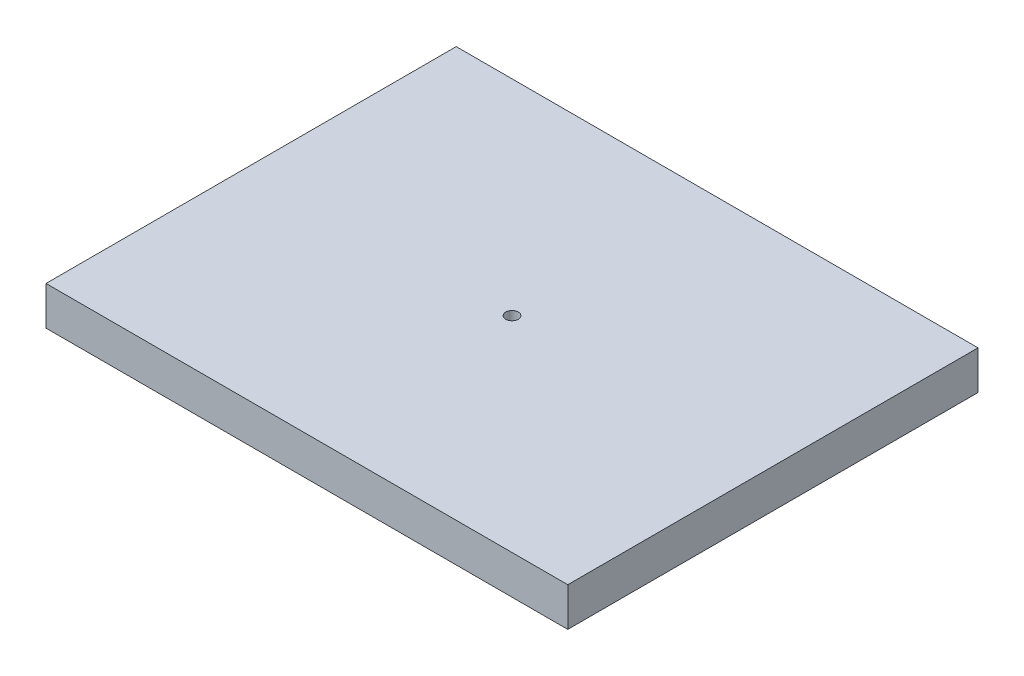
ISO-10303-21;
HEADER;
FILE_DESCRIPTION(('STEP AP214'),'2;1');
FILE_NAME('part.step','',(''),(''),'','','');
FILE_SCHEMA(('AUTOMOTIVE_DESIGN { 1 0 10303 214 1 1 1 1 }'));
ENDSEC;
DATA;
#1=APPLICATION_CONTEXT('core data for automotive mechanical design processes');
#2=APPLICATION_PROTOCOL_DEFINITION('international standard','automotive_design',2000,#1);
#3=PRODUCT_CONTEXT('',#1,'mechanical');
#4=PRODUCT('Part','Part','',(#3));
#5=PRODUCT_RELATED_PRODUCT_CATEGORY('part','',(#4));
#6=PRODUCT_DEFINITION_FORMATION('','',#4);
#7=PRODUCT_DEFINITION_CONTEXT('part definition',#1,'design');
#8=PRODUCT_DEFINITION('design','',#6,#7);
#9=PRODUCT_DEFINITION_SHAPE('','',#8);
#10=(LENGTH_UNIT() NAMED_UNIT(*) SI_UNIT(.MILLI.,.METRE.));
#11=(NAMED_UNIT(*) PLANE_ANGLE_UNIT() SI_UNIT($,.RADIAN.));
#12=(NAMED_UNIT(*) SI_UNIT($,.STERADIAN.) SOLID_ANGLE_UNIT());
#13=UNCERTAINTY_MEASURE_WITH_UNIT(LENGTH_MEASURE(1.E-05),#10,'distance_accuracy_value','');
#14=(GEOMETRIC_REPRESENTATION_CONTEXT(3) GLOBAL_UNCERTAINTY_ASSIGNED_CONTEXT((#13)) GLOBAL_UNIT_ASSIGNED_CONTEXT((#10,
#11,#12)) REPRESENTATION_CONTEXT('',''));
#15=CARTESIAN_POINT('',(0.,0.,0.));
#16=DIRECTION('',(0.,0.,1.));
#17=DIRECTION('',(1.,0.,0.));
#18=AXIS2_PLACEMENT_3D('',#15,#16,#17);
#19=CARTESIAN_POINT('',(68.4543835800034,10.16,53.8210189741331));
#20=DIRECTION('',(-1.,0.,0.));
#21=DIRECTION('',(0.,0.,1.));
#22=AXIS2_PLACEMENT_3D('',#19,#20,#21);
#23=PLANE('',#22);
#24=DIRECTION('',(0.,0.,-1.));
#25=VECTOR('',#24,1.);
#26=CARTESIAN_POINT('',(68.4543835800034,0.,53.8210189741331));
#27=LINE('',#26,#25);
#28=CARTESIAN_POINT('',(68.4543835800034,0.,53.8210189741331));
#29=VERTEX_POINT('',#28);
#30=CARTESIAN_POINT('',(68.4543835800034,0.,-53.8210189741331));
#31=VERTEX_POINT('',#30);
#32=EDGE_CURVE('E100',#29,#31,#27,.T.);
#33=ORIENTED_EDGE('',*,*,#32,.T.);
#34=DIRECTION('',(0.,-1.,0.));
#35=VECTOR('',#34,1.);
#36=CARTESIAN_POINT('',(68.4543835800034,10.16,-53.8210189741331));
#37=LINE('',#36,#35);
#38=CARTESIAN_POINT('',(68.4543835800034,10.16,-53.8210189741331));
#39=VERTEX_POINT('',#38);
#40=EDGE_CURVE('E11',#39,#31,#37,.T.);
#41=ORIENTED_EDGE('',*,*,#40,.F.);
#42=DIRECTION('',(0.,0.,-1.));
#43=VECTOR('',#42,1.);
#44=CARTESIAN_POINT('',(68.4543835800034,10.16,53.8210189741331));
#45=LINE('',#44,#43);
#46=CARTESIAN_POINT('',(68.4543835800034,10.16,53.8210189741331));
#47=VERTEX_POINT('',#46);
#48=EDGE_CURVE('E88',#47,#39,#45,.T.);
#49=ORIENTED_EDGE('',*,*,#48,.F.);
#50=DIRECTION('',(0.,-1.,0.));
#51=VECTOR('',#50,1.);
#52=CARTESIAN_POINT('',(68.4543835800034,10.16,53.8210189741331));
#53=LINE('',#52,#51);
#54=EDGE_CURVE('E96',#47,#29,#53,.T.);
#55=ORIENTED_EDGE('',*,*,#54,.T.);
#56=EDGE_LOOP('',(#33,#41,#49,#55));
#57=FACE_BOUND('',#56,.T.);
#58=ADVANCED_FACE('F37',(#57),#23,.F.);
#59=CARTESIAN_POINT('',(-68.4543835800034,10.16,-53.8210189741331));
#60=DIRECTION('',(0.,0.,1.));
#61=DIRECTION('',(1.,0.,0.));
#62=AXIS2_PLACEMENT_3D('',#59,#60,#61);
#63=PLANE('',#62);
#64=DIRECTION('',(-1.,0.,0.));
#65=VECTOR('',#64,1.);
#66=CARTESIAN_POINT('',(-68.4543835800034,0.,-53.8210189741331));
#67=LINE('',#66,#65);
#68=CARTESIAN_POINT('',(-68.4543835800034,0.,-53.8210189741331));
#69=VERTEX_POINT('',#68);
#70=EDGE_CURVE('E92',#31,#69,#67,.T.);
#71=ORIENTED_EDGE('',*,*,#70,.T.);
#72=DIRECTION('',(0.,-1.,0.));
#73=VECTOR('',#72,1.);
#74=CARTESIAN_POINT('',(-68.4543835800034,10.16,-53.8210189741331));
#75=LINE('',#74,#73);
#76=CARTESIAN_POINT('',(-68.4543835800034,10.16,-53.8210189741331));
#77=VERTEX_POINT('',#76);
#78=EDGE_CURVE('E45',#77,#69,#75,.T.);
#79=ORIENTED_EDGE('',*,*,#78,.F.);
#80=DIRECTION('',(-1.,0.,0.));
#81=VECTOR('',#80,1.);
#82=CARTESIAN_POINT('',(-68.4543835800034,10.16,-53.8210189741331));
#83=LINE('',#82,#81);
#84=EDGE_CURVE('E83',#39,#77,#83,.T.);
#85=ORIENTED_EDGE('',*,*,#84,.F.);
#86=ORIENTED_EDGE('',*,*,#40,.T.);
#87=EDGE_LOOP('',(#71,#79,#85,#86));
#88=FACE_BOUND('',#87,.T.);
#89=ADVANCED_FACE('F91',(#88),#63,.F.);
#90=CARTESIAN_POINT('',(-68.4543835800034,10.16,53.8210189741331));
#91=DIRECTION('',(1.,0.,0.));
#92=DIRECTION('',(0.,0.,-1.));
#93=AXIS2_PLACEMENT_3D('',#90,#91,#92);
#94=PLANE('',#93);
#95=DIRECTION('',(0.,0.,1.));
#96=VECTOR('',#95,1.);
#97=CARTESIAN_POINT('',(-68.4543835800034,0.,53.8210189741331));
#98=LINE('',#97,#96);
#99=CARTESIAN_POINT('',(-68.4543835800034,0.,53.8210189741331));
#100=VERTEX_POINT('',#99);
#101=EDGE_CURVE('E70',#69,#100,#98,.T.);
#102=ORIENTED_EDGE('',*,*,#101,.T.);
#103=DIRECTION('',(0.,-1.,0.));
#104=VECTOR('',#103,1.);
#105=CARTESIAN_POINT('',(-68.4543835800034,10.16,53.8210189741331));
#106=LINE('',#105,#104);
#107=CARTESIAN_POINT('',(-68.4543835800034,10.16,53.8210189741331));
#108=VERTEX_POINT('',#107);
#109=EDGE_CURVE('E93',#108,#100,#106,.T.);
#110=ORIENTED_EDGE('',*,*,#109,.F.);
#111=DIRECTION('',(0.,0.,1.));
#112=VECTOR('',#111,1.);
#113=CARTESIAN_POINT('',(-68.4543835800034,10.16,53.8210189741331));
#114=LINE('',#113,#112);
#115=EDGE_CURVE('E86',#77,#108,#114,.T.);
#116=ORIENTED_EDGE('',*,*,#115,.F.);
#117=ORIENTED_EDGE('',*,*,#78,.T.);
#118=EDGE_LOOP('',(#102,#110,#116,#117));
#119=FACE_BOUND('',#118,.T.);
#120=ADVANCED_FACE('F94',(#119),#94,.F.);
#121=CARTESIAN_POINT('',(-68.4543835800034,10.16,53.8210189741331));
#122=DIRECTION('',(0.,0.,-1.));
#123=DIRECTION('',(-1.,0.,0.));
#124=AXIS2_PLACEMENT_3D('',#121,#122,#123);
#125=PLANE('',#124);
#126=DIRECTION('',(1.,0.,0.));
#127=VECTOR('',#126,1.);
#128=CARTESIAN_POINT('',(-68.4543835800034,0.,53.8210189741331));
#129=LINE('',#128,#127);
#130=EDGE_CURVE('E76',#100,#29,#129,.T.);
#131=ORIENTED_EDGE('',*,*,#130,.T.);
#132=ORIENTED_EDGE('',*,*,#54,.F.);
#133=DIRECTION('',(1.,0.,0.));
#134=VECTOR('',#133,1.);
#135=CARTESIAN_POINT('',(-68.4543835800034,10.16,53.8210189741331));
#136=LINE('',#135,#134);
#137=EDGE_CURVE('E53',#108,#47,#136,.T.);
#138=ORIENTED_EDGE('',*,*,#137,.F.);
#139=ORIENTED_EDGE('',*,*,#109,.T.);
#140=EDGE_LOOP('',(#131,#132,#138,#139));
#141=FACE_BOUND('',#140,.T.);
#142=ADVANCED_FACE('F108',(#141),#125,.F.);
#143=CARTESIAN_POINT('',(0.,10.16,0.));
#144=DIRECTION('',(0.,-1.,0.));
#145=DIRECTION('',(0.,0.,-1.));
#146=AXIS2_PLACEMENT_3D('',#143,#144,#145);
#147=PLANE('',#146);
#148=CARTESIAN_POINT('',(0.,10.16,0.));
#149=DIRECTION('',(0.,1.,0.));
#150=DIRECTION('',(0.,0.,1.));
#151=AXIS2_PLACEMENT_3D('',#148,#149,#150);
#152=CIRCLE('',#151,1.65);
#153=CARTESIAN_POINT('',(0.,10.16,1.65));
#154=VERTEX_POINT('',#153);
#155=EDGE_CURVE('E116',#154,#154,#152,.T.);
#156=ORIENTED_EDGE('',*,*,#155,.F.);
#157=EDGE_LOOP('',(#156));
#158=FACE_BOUND('',#157,.T.);
#159=ORIENTED_EDGE('',*,*,#48,.T.);
#160=ORIENTED_EDGE('',*,*,#84,.T.);
#161=ORIENTED_EDGE('',*,*,#115,.T.);
#162=ORIENTED_EDGE('',*,*,#137,.T.);
#163=EDGE_LOOP('',(#159,#160,#161,#162));
#164=FACE_BOUND('',#163,.T.);
#165=ADVANCED_FACE('F84',(#158,#164),#147,.F.);
#166=CARTESIAN_POINT('',(0.,0.,0.));
#167=DIRECTION('',(0.,-1.,0.));
#168=DIRECTION('',(0.,0.,-1.));
#169=AXIS2_PLACEMENT_3D('',#166,#167,#168);
#170=PLANE('',#169);
#171=CARTESIAN_POINT('',(0.,0.,0.));
#172=DIRECTION('',(0.,1.,0.));
#173=DIRECTION('',(0.,0.,1.));
#174=AXIS2_PLACEMENT_3D('',#171,#172,#173);
#175=CIRCLE('',#174,1.65);
#176=CARTESIAN_POINT('',(0.,0.,1.65));
#177=VERTEX_POINT('',#176);
#178=EDGE_CURVE('E103',#177,#177,#175,.T.);
#179=ORIENTED_EDGE('',*,*,#178,.T.);
#180=EDGE_LOOP('',(#179));
#181=FACE_BOUND('',#180,.T.);
#182=ORIENTED_EDGE('',*,*,#32,.F.);
#183=ORIENTED_EDGE('',*,*,#130,.F.);
#184=ORIENTED_EDGE('',*,*,#101,.F.);
#185=ORIENTED_EDGE('',*,*,#70,.F.);
#186=EDGE_LOOP('',(#182,#183,#184,#185));
#187=FACE_BOUND('',#186,.T.);
#188=ADVANCED_FACE('F111',(#181,#187),#170,.T.);
#189=CARTESIAN_POINT('',(0.,10.16,0.));
#190=DIRECTION('',(0.,1.,0.));
#191=DIRECTION('',(0.,0.,1.));
#192=AXIS2_PLACEMENT_3D('',#189,#190,#191);
#193=CYLINDRICAL_SURFACE('',#192,1.65);
#194=ORIENTED_EDGE('',*,*,#178,.F.);
#195=EDGE_LOOP('',(#194));
#196=FACE_BOUND('',#195,.T.);
#197=ORIENTED_EDGE('',*,*,#155,.T.);
#198=EDGE_LOOP('',(#197));
#199=FACE_BOUND('',#198,.T.);
#200=ADVANCED_FACE('F120',(#196,#199),#193,.F.);
#201=CLOSED_SHELL('',(#58,#89,#120,#142,#165,#188,#200));
#202=MANIFOLD_SOLID_BREP('B2',#201);
#203=ADVANCED_BREP_SHAPE_REPRESENTATION('',(#18,#202),#14);
#204=SHAPE_DEFINITION_REPRESENTATION(#9,#203);
ENDSEC;
END-ISO-10303-21;
